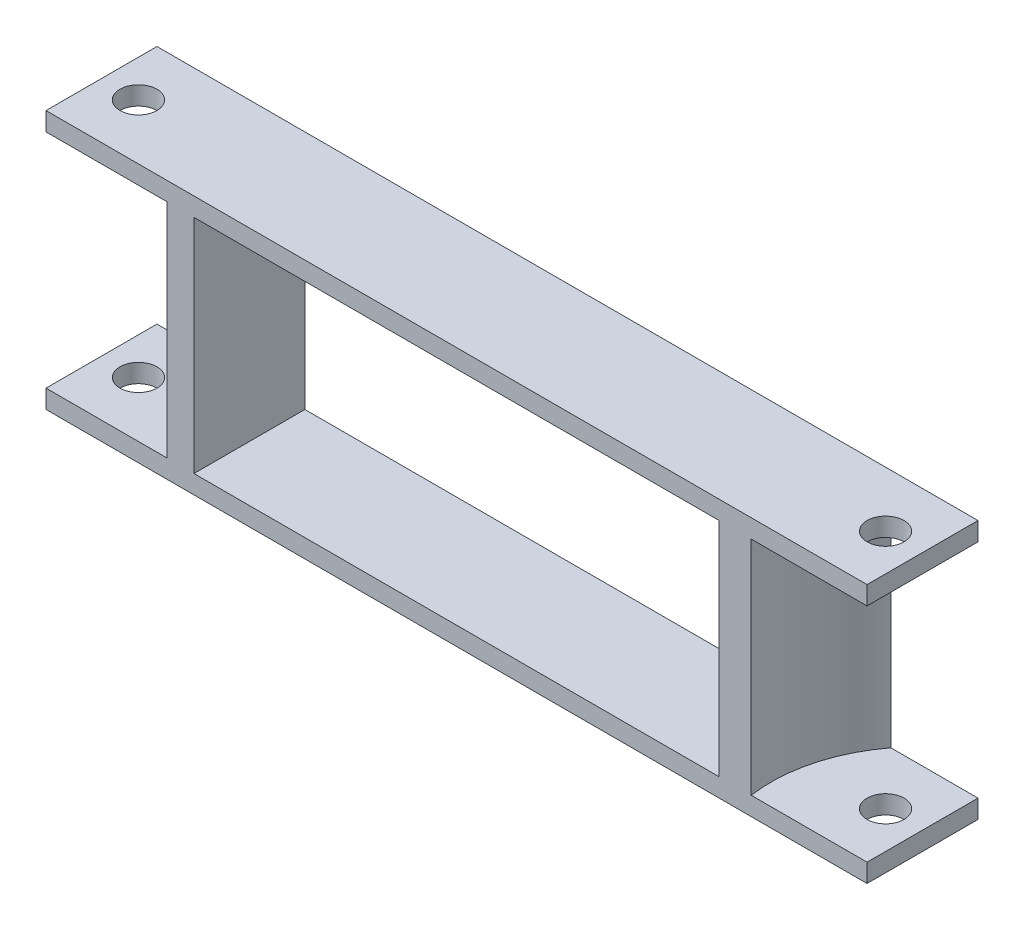
ISO-10303-21;
HEADER;
FILE_DESCRIPTION(('STEP AP214'),'2;1');
FILE_NAME('part.step','',(''),(''),'','','');
FILE_SCHEMA(('AUTOMOTIVE_DESIGN { 1 0 10303 214 1 1 1 1 }'));
ENDSEC;
DATA;
#1=APPLICATION_CONTEXT('core data for automotive mechanical design processes');
#2=APPLICATION_PROTOCOL_DEFINITION('international standard','automotive_design',2000,#1);
#3=PRODUCT_CONTEXT('',#1,'mechanical');
#4=PRODUCT('Part','Part','',(#3));
#5=PRODUCT_RELATED_PRODUCT_CATEGORY('part','',(#4));
#6=PRODUCT_DEFINITION_FORMATION('','',#4);
#7=PRODUCT_DEFINITION_CONTEXT('part definition',#1,'design');
#8=PRODUCT_DEFINITION('design','',#6,#7);
#9=PRODUCT_DEFINITION_SHAPE('','',#8);
#10=(LENGTH_UNIT() NAMED_UNIT(*) SI_UNIT(.MILLI.,.METRE.));
#11=(NAMED_UNIT(*) PLANE_ANGLE_UNIT() SI_UNIT($,.RADIAN.));
#12=(NAMED_UNIT(*) SI_UNIT($,.STERADIAN.) SOLID_ANGLE_UNIT());
#13=UNCERTAINTY_MEASURE_WITH_UNIT(LENGTH_MEASURE(1.E-05),#10,'distance_accuracy_value','');
#14=(GEOMETRIC_REPRESENTATION_CONTEXT(3) GLOBAL_UNCERTAINTY_ASSIGNED_CONTEXT((#13)) GLOBAL_UNIT_ASSIGNED_CONTEXT((#10,
#11,#12)) REPRESENTATION_CONTEXT('',''));
#15=CARTESIAN_POINT('',(0.,0.,0.));
#16=DIRECTION('',(0.,0.,1.));
#17=DIRECTION('',(1.,0.,0.));
#18=AXIS2_PLACEMENT_3D('',#15,#16,#17);
#19=CARTESIAN_POINT('',(-36.1060293280182,70.,11.328125));
#20=DIRECTION('',(1.,0.,0.));
#21=DIRECTION('',(0.,0.,-1.));
#22=AXIS2_PLACEMENT_3D('',#19,#20,#21);
#23=PLANE('',#22);
#24=DIRECTION('',(0.,0.,-1.));
#25=VECTOR('',#24,1.);
#26=CARTESIAN_POINT('',(-36.1060293280182,65.,11.328125));
#27=LINE('',#26,#25);
#28=CARTESIAN_POINT('',(-36.1060293280182,65.,11.328125));
#29=VERTEX_POINT('',#28);
#30=CARTESIAN_POINT('',(-36.1060293280182,65.,-18.671875));
#31=VERTEX_POINT('',#30);
#32=EDGE_CURVE('E242',#29,#31,#27,.T.);
#33=ORIENTED_EDGE('',*,*,#32,.F.);
#34=DIRECTION('',(0.,-1.,0.));
#35=VECTOR('',#34,1.);
#36=CARTESIAN_POINT('',(-36.1060293280182,70.,11.328125));
#37=LINE('',#36,#35);
#38=CARTESIAN_POINT('',(-36.1060293280182,70.,11.328125));
#39=VERTEX_POINT('',#38);
#40=EDGE_CURVE('E328',#39,#29,#37,.T.);
#41=ORIENTED_EDGE('',*,*,#40,.F.);
#42=DIRECTION('',(0.,0.,1.));
#43=VECTOR('',#42,1.);
#44=CARTESIAN_POINT('',(-36.1060293280182,70.,11.328125));
#45=LINE('',#44,#43);
#46=CARTESIAN_POINT('',(-36.1060293280182,70.,-18.671875));
#47=VERTEX_POINT('',#46);
#48=EDGE_CURVE('E284',#47,#39,#45,.T.);
#49=ORIENTED_EDGE('',*,*,#48,.F.);
#50=DIRECTION('',(0.,-1.,0.));
#51=VECTOR('',#50,1.);
#52=CARTESIAN_POINT('',(-36.1060293280182,70.,-18.671875));
#53=LINE('',#52,#51);
#54=EDGE_CURVE('E313',#47,#31,#53,.T.);
#55=ORIENTED_EDGE('',*,*,#54,.T.);
#56=EDGE_LOOP('',(#33,#41,#49,#55));
#57=FACE_BOUND('',#56,.T.);
#58=ADVANCED_FACE('F39',(#57),#23,.F.);
#59=CARTESIAN_POINT('',(185.893970671982,70.,11.328125));
#60=DIRECTION('',(-1.,0.,0.));
#61=DIRECTION('',(0.,0.,1.));
#62=AXIS2_PLACEMENT_3D('',#59,#60,#61);
#63=PLANE('',#62);
#64=DIRECTION('',(0.,0.,1.));
#65=VECTOR('',#64,1.);
#66=CARTESIAN_POINT('',(185.893970671982,65.,11.328125));
#67=LINE('',#66,#65);
#68=CARTESIAN_POINT('',(185.893970671982,65.,-18.671875));
#69=VERTEX_POINT('',#68);
#70=CARTESIAN_POINT('',(185.893970671982,65.,11.328125));
#71=VERTEX_POINT('',#70);
#72=EDGE_CURVE('E219',#69,#71,#67,.T.);
#73=ORIENTED_EDGE('',*,*,#72,.F.);
#74=DIRECTION('',(0.,-1.,0.));
#75=VECTOR('',#74,1.);
#76=CARTESIAN_POINT('',(185.893970671982,70.,-18.671875));
#77=LINE('',#76,#75);
#78=CARTESIAN_POINT('',(185.893970671982,70.,-18.671875));
#79=VERTEX_POINT('',#78);
#80=EDGE_CURVE('E318',#79,#69,#77,.T.);
#81=ORIENTED_EDGE('',*,*,#80,.F.);
#82=DIRECTION('',(0.,0.,-1.));
#83=VECTOR('',#82,1.);
#84=CARTESIAN_POINT('',(185.893970671982,70.,11.328125));
#85=LINE('',#84,#83);
#86=CARTESIAN_POINT('',(185.893970671982,70.,11.328125));
#87=VERTEX_POINT('',#86);
#88=EDGE_CURVE('E292',#87,#79,#85,.T.);
#89=ORIENTED_EDGE('',*,*,#88,.F.);
#90=DIRECTION('',(0.,-1.,0.));
#91=VECTOR('',#90,1.);
#92=CARTESIAN_POINT('',(185.893970671982,70.,11.328125));
#93=LINE('',#92,#91);
#94=EDGE_CURVE('E323',#87,#71,#93,.T.);
#95=ORIENTED_EDGE('',*,*,#94,.T.);
#96=EDGE_LOOP('',(#73,#81,#89,#95));
#97=FACE_BOUND('',#96,.T.);
#98=ADVANCED_FACE('F360',(#97),#63,.F.);
#99=CARTESIAN_POINT('',(-26.1060293280182,70.,-3.671875));
#100=DIRECTION('',(0.,-1.,0.));
#101=DIRECTION('',(0.,0.,-1.));
#102=AXIS2_PLACEMENT_3D('',#99,#100,#101);
#103=CYLINDRICAL_SURFACE('',#102,5.);
#104=CARTESIAN_POINT('',(-26.1060293280182,70.,-3.671875));
#105=DIRECTION('',(0.,1.,0.));
#106=DIRECTION('',(0.,0.,1.));
#107=AXIS2_PLACEMENT_3D('',#104,#105,#106);
#108=CIRCLE('',#107,5.);
#109=CARTESIAN_POINT('',(-26.1060293280182,70.,1.328125));
#110=VERTEX_POINT('',#109);
#111=EDGE_CURVE('E276',#110,#110,#108,.T.);
#112=ORIENTED_EDGE('',*,*,#111,.T.);
#113=EDGE_LOOP('',(#112));
#114=FACE_BOUND('',#113,.T.);
#115=CARTESIAN_POINT('',(-26.1060293280182,65.,-3.671875));
#116=DIRECTION('',(0.,-1.,0.));
#117=DIRECTION('',(0.,0.,-1.));
#118=AXIS2_PLACEMENT_3D('',#115,#116,#117);
#119=CIRCLE('',#118,5.);
#120=CARTESIAN_POINT('',(-26.1060293280182,65.,-8.671875));
#121=VERTEX_POINT('',#120);
#122=EDGE_CURVE('E238',#121,#121,#119,.T.);
#123=ORIENTED_EDGE('',*,*,#122,.T.);
#124=EDGE_LOOP('',(#123));
#125=FACE_BOUND('',#124,.T.);
#126=ADVANCED_FACE('F412',(#114,#125),#103,.F.);
#127=CARTESIAN_POINT('',(175.893970671982,70.,-3.671875));
#128=DIRECTION('',(0.,-1.,0.));
#129=DIRECTION('',(0.,0.,-1.));
#130=AXIS2_PLACEMENT_3D('',#127,#128,#129);
#131=CYLINDRICAL_SURFACE('',#130,4.99999999999999);
#132=CARTESIAN_POINT('',(175.893970671982,70.,-3.671875));
#133=DIRECTION('',(0.,1.,0.));
#134=DIRECTION('',(0.,0.,1.));
#135=AXIS2_PLACEMENT_3D('',#132,#133,#134);
#136=CIRCLE('',#135,4.99999999999999);
#137=CARTESIAN_POINT('',(175.893970671982,70.,1.32812499999999));
#138=VERTEX_POINT('',#137);
#139=EDGE_CURVE('E268',#138,#138,#136,.T.);
#140=ORIENTED_EDGE('',*,*,#139,.T.);
#141=EDGE_LOOP('',(#140));
#142=FACE_BOUND('',#141,.T.);
#143=CARTESIAN_POINT('',(175.893970671982,65.,-3.671875));
#144=DIRECTION('',(0.,-1.,0.));
#145=DIRECTION('',(0.,0.,-1.));
#146=AXIS2_PLACEMENT_3D('',#143,#144,#145);
#147=CIRCLE('',#146,4.99999999999999);
#148=CARTESIAN_POINT('',(175.893970671982,65.,-8.67187499999999));
#149=VERTEX_POINT('',#148);
#150=EDGE_CURVE('E210',#149,#149,#147,.T.);
#151=ORIENTED_EDGE('',*,*,#150,.T.);
#152=EDGE_LOOP('',(#151));
#153=FACE_BOUND('',#152,.T.);
#154=ADVANCED_FACE('F404',(#142,#153),#131,.F.);
#155=CARTESIAN_POINT('',(0.,70.,0.));
#156=DIRECTION('',(0.,-1.,0.));
#157=DIRECTION('',(0.,0.,-1.));
#158=AXIS2_PLACEMENT_3D('',#155,#156,#157);
#159=PLANE('',#158);
#160=ORIENTED_EDGE('',*,*,#48,.T.);
#161=DIRECTION('',(1.,0.,0.));
#162=VECTOR('',#161,1.);
#163=CARTESIAN_POINT('',(-36.1060293280182,70.,11.328125));
#164=LINE('',#163,#162);
#165=EDGE_CURVE('E288',#39,#87,#164,.T.);
#166=ORIENTED_EDGE('',*,*,#165,.T.);
#167=ORIENTED_EDGE('',*,*,#88,.T.);
#168=DIRECTION('',(-1.,0.,0.));
#169=VECTOR('',#168,1.);
#170=CARTESIAN_POINT('',(-36.1060293280182,70.,-18.671875));
#171=LINE('',#170,#169);
#172=EDGE_CURVE('E295',#79,#47,#171,.T.);
#173=ORIENTED_EDGE('',*,*,#172,.T.);
#174=EDGE_LOOP('',(#160,#166,#167,#173));
#175=FACE_BOUND('',#174,.T.);
#176=ORIENTED_EDGE('',*,*,#111,.F.);
#177=EDGE_LOOP('',(#176));
#178=FACE_BOUND('',#177,.T.);
#179=ORIENTED_EDGE('',*,*,#139,.F.);
#180=EDGE_LOOP('',(#179));
#181=FACE_BOUND('',#180,.T.);
#182=ADVANCED_FACE('F401',(#175,#178,#181),#159,.F.);
#183=CARTESIAN_POINT('',(0.,0.,0.));
#184=DIRECTION('',(0.,-1.,0.));
#185=DIRECTION('',(0.,0.,-1.));
#186=AXIS2_PLACEMENT_3D('',#183,#184,#185);
#187=PLANE('',#186);
#188=CARTESIAN_POINT('',(-26.1060293280182,0.,-3.671875));
#189=DIRECTION('',(0.,1.,0.));
#190=DIRECTION('',(0.,0.,1.));
#191=AXIS2_PLACEMENT_3D('',#188,#189,#190);
#192=CIRCLE('',#191,5.);
#193=CARTESIAN_POINT('',(-26.1060293280182,0.,1.328125));
#194=VERTEX_POINT('',#193);
#195=EDGE_CURVE('E272',#194,#194,#192,.T.);
#196=ORIENTED_EDGE('',*,*,#195,.T.);
#197=EDGE_LOOP('',(#196));
#198=FACE_BOUND('',#197,.T.);
#199=DIRECTION('',(0.,0.,1.));
#200=VECTOR('',#199,1.);
#201=CARTESIAN_POINT('',(-36.1060293280182,0.,11.328125));
#202=LINE('',#201,#200);
#203=CARTESIAN_POINT('',(-36.1060293280182,0.,-18.671875));
#204=VERTEX_POINT('',#203);
#205=CARTESIAN_POINT('',(-36.1060293280182,0.,11.328125));
#206=VERTEX_POINT('',#205);
#207=EDGE_CURVE('E280',#204,#206,#202,.T.);
#208=ORIENTED_EDGE('',*,*,#207,.F.);
#209=DIRECTION('',(-1.,0.,0.));
#210=VECTOR('',#209,1.);
#211=CARTESIAN_POINT('',(-36.1060293280182,0.,-18.671875));
#212=LINE('',#211,#210);
#213=CARTESIAN_POINT('',(185.893970671982,0.,-18.671875));
#214=VERTEX_POINT('',#213);
#215=EDGE_CURVE('E289',#214,#204,#212,.T.);
#216=ORIENTED_EDGE('',*,*,#215,.F.);
#217=DIRECTION('',(0.,0.,-1.));
#218=VECTOR('',#217,1.);
#219=CARTESIAN_POINT('',(185.893970671982,0.,11.328125));
#220=LINE('',#219,#218);
#221=CARTESIAN_POINT('',(185.893970671982,0.,11.328125));
#222=VERTEX_POINT('',#221);
#223=EDGE_CURVE('E306',#222,#214,#220,.T.);
#224=ORIENTED_EDGE('',*,*,#223,.F.);
#225=DIRECTION('',(1.,0.,0.));
#226=VECTOR('',#225,1.);
#227=CARTESIAN_POINT('',(-36.1060293280182,0.,11.328125));
#228=LINE('',#227,#226);
#229=EDGE_CURVE('E302',#206,#222,#228,.T.);
#230=ORIENTED_EDGE('',*,*,#229,.F.);
#231=EDGE_LOOP('',(#208,#216,#224,#230));
#232=FACE_BOUND('',#231,.T.);
#233=CARTESIAN_POINT('',(175.893970671982,0.,-3.671875));
#234=DIRECTION('',(0.,1.,0.));
#235=DIRECTION('',(0.,0.,1.));
#236=AXIS2_PLACEMENT_3D('',#233,#234,#235);
#237=CIRCLE('',#236,4.99999999999999);
#238=CARTESIAN_POINT('',(175.893970671982,0.,1.32812499999999));
#239=VERTEX_POINT('',#238);
#240=EDGE_CURVE('E267',#239,#239,#237,.T.);
#241=ORIENTED_EDGE('',*,*,#240,.T.);
#242=EDGE_LOOP('',(#241));
#243=FACE_BOUND('',#242,.T.);
#244=ADVANCED_FACE('F382',(#198,#232,#243),#187,.T.);
#245=CARTESIAN_POINT('',(-36.1060293280182,5.,11.328125));
#246=VERTEX_POINT('',#245);
#247=EDGE_CURVE('E327',#246,#206,#37,.T.);
#248=ORIENTED_EDGE('',*,*,#247,.F.);
#249=DIRECTION('',(0.,0.,-1.));
#250=VECTOR('',#249,1.);
#251=CARTESIAN_POINT('',(-36.1060293280182,5.,11.328125));
#252=LINE('',#251,#250);
#253=CARTESIAN_POINT('',(-36.1060293280182,5.,-18.671875));
#254=VERTEX_POINT('',#253);
#255=EDGE_CURVE('E253',#246,#254,#252,.T.);
#256=ORIENTED_EDGE('',*,*,#255,.T.);
#257=EDGE_CURVE('E298',#254,#204,#53,.T.);
#258=ORIENTED_EDGE('',*,*,#257,.T.);
#259=ORIENTED_EDGE('',*,*,#207,.T.);
#260=EDGE_LOOP('',(#248,#256,#258,#259));
#261=FACE_BOUND('',#260,.T.);
#262=ADVANCED_FACE('F41',(#261),#23,.F.);
#263=CARTESIAN_POINT('',(-36.1060293280182,70.,11.328125));
#264=DIRECTION('',(0.,0.,-1.));
#265=DIRECTION('',(-1.,0.,0.));
#266=AXIS2_PLACEMENT_3D('',#263,#264,#265);
#267=PLANE('',#266);
#268=DIRECTION('',(1.,0.,0.));
#269=VECTOR('',#268,1.);
#270=CARTESIAN_POINT('',(3.89397067198179,5.,11.328125));
#271=LINE('',#270,#269);
#272=CARTESIAN_POINT('',(3.89397067198179,5.,11.328125));
#273=VERTEX_POINT('',#272);
#274=CARTESIAN_POINT('',(145.893970671982,5.,11.328125));
#275=VERTEX_POINT('',#274);
#276=EDGE_CURVE('E186',#273,#275,#271,.T.);
#277=ORIENTED_EDGE('',*,*,#276,.F.);
#278=DIRECTION('',(0.,-1.,0.));
#279=VECTOR('',#278,1.);
#280=CARTESIAN_POINT('',(3.89397067198178,65.,11.328125));
#281=LINE('',#280,#279);
#282=CARTESIAN_POINT('',(3.89397067198178,65.,11.328125));
#283=VERTEX_POINT('',#282);
#284=EDGE_CURVE('E55',#283,#273,#281,.T.);
#285=ORIENTED_EDGE('',*,*,#284,.F.);
#286=DIRECTION('',(-1.,0.,0.));
#287=VECTOR('',#286,1.);
#288=CARTESIAN_POINT('',(3.89397067198178,65.,11.328125));
#289=LINE('',#288,#287);
#290=CARTESIAN_POINT('',(145.893970671982,65.,11.328125));
#291=VERTEX_POINT('',#290);
#292=EDGE_CURVE('E173',#291,#283,#289,.T.);
#293=ORIENTED_EDGE('',*,*,#292,.F.);
#294=DIRECTION('',(0.,1.,0.));
#295=VECTOR('',#294,1.);
#296=CARTESIAN_POINT('',(145.893970671982,65.,11.328125));
#297=LINE('',#296,#295);
#298=EDGE_CURVE('E177',#275,#291,#297,.T.);
#299=ORIENTED_EDGE('',*,*,#298,.F.);
#300=EDGE_LOOP('',(#277,#285,#293,#299));
#301=FACE_BOUND('',#300,.T.);
#302=DIRECTION('',(0.,1.,0.));
#303=VECTOR('',#302,1.);
#304=CARTESIAN_POINT('',(-3.40368519777205,5.,11.328125));
#305=LINE('',#304,#303);
#306=CARTESIAN_POINT('',(-3.40368519777205,5.,11.328125));
#307=VERTEX_POINT('',#306);
#308=CARTESIAN_POINT('',(-3.40368519777205,65.,11.328125));
#309=VERTEX_POINT('',#308);
#310=EDGE_CURVE('E264',#307,#309,#305,.T.);
#311=ORIENTED_EDGE('',*,*,#310,.F.);
#312=DIRECTION('',(-1.,0.,0.));
#313=VECTOR('',#312,1.);
#314=CARTESIAN_POINT('',(-36.1060293280182,5.,11.328125));
#315=LINE('',#314,#313);
#316=EDGE_CURVE('E257',#307,#246,#315,.T.);
#317=ORIENTED_EDGE('',*,*,#316,.T.);
#318=ORIENTED_EDGE('',*,*,#247,.T.);
#319=ORIENTED_EDGE('',*,*,#229,.T.);
#320=CARTESIAN_POINT('',(185.893970671982,5.,11.328125));
#321=VERTEX_POINT('',#320);
#322=EDGE_CURVE('E322',#321,#222,#93,.T.);
#323=ORIENTED_EDGE('',*,*,#322,.F.);
#324=DIRECTION('',(-1.,0.,0.));
#325=VECTOR('',#324,1.);
#326=CARTESIAN_POINT('',(-36.1060293280182,5.,11.328125));
#327=LINE('',#326,#325);
#328=CARTESIAN_POINT('',(154.572983376168,5.,11.328125));
#329=VERTEX_POINT('',#328);
#330=EDGE_CURVE('E234',#321,#329,#327,.T.);
#331=ORIENTED_EDGE('',*,*,#330,.T.);
#332=DIRECTION('',(0.,1.,0.));
#333=VECTOR('',#332,1.);
#334=CARTESIAN_POINT('',(154.572983376168,5.,11.328125));
#335=LINE('',#334,#333);
#336=CARTESIAN_POINT('',(154.572983376168,65.,11.328125));
#337=VERTEX_POINT('',#336);
#338=EDGE_CURVE('E261',#337,#329,#335,.F.);
#339=ORIENTED_EDGE('',*,*,#338,.F.);
#340=DIRECTION('',(-1.,0.,0.));
#341=VECTOR('',#340,1.);
#342=CARTESIAN_POINT('',(-36.1060293280182,65.,11.328125));
#343=LINE('',#342,#341);
#344=EDGE_CURVE('E222',#71,#337,#343,.T.);
#345=ORIENTED_EDGE('',*,*,#344,.F.);
#346=ORIENTED_EDGE('',*,*,#94,.F.);
#347=ORIENTED_EDGE('',*,*,#165,.F.);
#348=ORIENTED_EDGE('',*,*,#40,.T.);
#349=DIRECTION('',(-1.,0.,0.));
#350=VECTOR('',#349,1.);
#351=CARTESIAN_POINT('',(-36.1060293280182,65.,11.328125));
#352=LINE('',#351,#350);
#353=EDGE_CURVE('E245',#309,#29,#352,.T.);
#354=ORIENTED_EDGE('',*,*,#353,.F.);
#355=EDGE_LOOP('',(#311,#317,#318,#319,#323,#331,#339,#345,#346,#347,#348,#354));
#356=FACE_BOUND('',#355,.T.);
#357=ADVANCED_FACE('F365',(#301,#356),#267,.F.);
#358=CARTESIAN_POINT('',(185.893970671982,5.,-18.671875));
#359=VERTEX_POINT('',#358);
#360=EDGE_CURVE('E317',#359,#214,#77,.T.);
#361=ORIENTED_EDGE('',*,*,#360,.F.);
#362=DIRECTION('',(0.,0.,1.));
#363=VECTOR('',#362,1.);
#364=CARTESIAN_POINT('',(185.893970671982,5.,11.328125));
#365=LINE('',#364,#363);
#366=EDGE_CURVE('E230',#359,#321,#365,.T.);
#367=ORIENTED_EDGE('',*,*,#366,.T.);
#368=ORIENTED_EDGE('',*,*,#322,.T.);
#369=ORIENTED_EDGE('',*,*,#223,.T.);
#370=EDGE_LOOP('',(#361,#367,#368,#369));
#371=FACE_BOUND('',#370,.T.);
#372=ADVANCED_FACE('F371',(#371),#63,.F.);
#373=CARTESIAN_POINT('',(-36.1060293280182,70.,-18.671875));
#374=DIRECTION('',(0.,0.,1.));
#375=DIRECTION('',(1.,0.,0.));
#376=AXIS2_PLACEMENT_3D('',#373,#374,#375);
#377=PLANE('',#376);
#378=DIRECTION('',(-1.,0.,0.));
#379=VECTOR('',#378,1.);
#380=CARTESIAN_POINT('',(3.89397067198178,65.,-18.671875));
#381=LINE('',#380,#379);
#382=CARTESIAN_POINT('',(145.893970671982,65.,-18.671875));
#383=VERTEX_POINT('',#382);
#384=CARTESIAN_POINT('',(3.89397067198178,65.,-18.671875));
#385=VERTEX_POINT('',#384);
#386=EDGE_CURVE('E161',#383,#385,#381,.T.);
#387=ORIENTED_EDGE('',*,*,#386,.T.);
#388=DIRECTION('',(0.,-1.,0.));
#389=VECTOR('',#388,1.);
#390=CARTESIAN_POINT('',(3.89397067198178,65.,-18.671875));
#391=LINE('',#390,#389);
#392=CARTESIAN_POINT('',(3.89397067198179,5.,-18.671875));
#393=VERTEX_POINT('',#392);
#394=EDGE_CURVE('E154',#385,#393,#391,.T.);
#395=ORIENTED_EDGE('',*,*,#394,.T.);
#396=DIRECTION('',(1.,0.,0.));
#397=VECTOR('',#396,1.);
#398=CARTESIAN_POINT('',(3.89397067198179,5.,-18.671875));
#399=LINE('',#398,#397);
#400=CARTESIAN_POINT('',(145.893970671982,5.,-18.671875));
#401=VERTEX_POINT('',#400);
#402=EDGE_CURVE('E164',#393,#401,#399,.T.);
#403=ORIENTED_EDGE('',*,*,#402,.T.);
#404=DIRECTION('',(0.,1.,0.));
#405=VECTOR('',#404,1.);
#406=CARTESIAN_POINT('',(145.893970671982,65.,-18.671875));
#407=LINE('',#406,#405);
#408=EDGE_CURVE('E63',#401,#383,#407,.T.);
#409=ORIENTED_EDGE('',*,*,#408,.T.);
#410=EDGE_LOOP('',(#387,#395,#403,#409));
#411=FACE_BOUND('',#410,.T.);
#412=ORIENTED_EDGE('',*,*,#257,.F.);
#413=DIRECTION('',(1.,0.,0.));
#414=VECTOR('',#413,1.);
#415=CARTESIAN_POINT('',(-36.1060293280182,5.,-18.671875));
#416=LINE('',#415,#414);
#417=CARTESIAN_POINT('',(-8.33885668442236,5.,-18.671875));
#418=VERTEX_POINT('',#417);
#419=EDGE_CURVE('E249',#254,#418,#416,.T.);
#420=ORIENTED_EDGE('',*,*,#419,.T.);
#421=DIRECTION('',(0.,1.,0.));
#422=VECTOR('',#421,1.);
#423=CARTESIAN_POINT('',(-8.33885668442236,5.,-18.671875));
#424=LINE('',#423,#422);
#425=CARTESIAN_POINT('',(-8.33885668442236,65.,-18.671875));
#426=VERTEX_POINT('',#425);
#427=EDGE_CURVE('E11',#426,#418,#424,.F.);
#428=ORIENTED_EDGE('',*,*,#427,.F.);
#429=DIRECTION('',(1.,0.,0.));
#430=VECTOR('',#429,1.);
#431=CARTESIAN_POINT('',(-36.1060293280182,65.,-18.671875));
#432=LINE('',#431,#430);
#433=EDGE_CURVE('E239',#31,#426,#432,.T.);
#434=ORIENTED_EDGE('',*,*,#433,.F.);
#435=ORIENTED_EDGE('',*,*,#54,.F.);
#436=ORIENTED_EDGE('',*,*,#172,.F.);
#437=ORIENTED_EDGE('',*,*,#80,.T.);
#438=DIRECTION('',(1.,0.,0.));
#439=VECTOR('',#438,1.);
#440=CARTESIAN_POINT('',(-36.1060293280182,65.,-18.671875));
#441=LINE('',#440,#439);
#442=CARTESIAN_POINT('',(162.349650774549,65.,-18.671875));
#443=VERTEX_POINT('',#442);
#444=EDGE_CURVE('E216',#443,#69,#441,.T.);
#445=ORIENTED_EDGE('',*,*,#444,.F.);
#446=DIRECTION('',(0.,1.,0.));
#447=VECTOR('',#446,1.);
#448=CARTESIAN_POINT('',(162.349650774549,5.,-18.671875));
#449=LINE('',#448,#447);
#450=CARTESIAN_POINT('',(162.349650774549,5.,-18.671875));
#451=VERTEX_POINT('',#450);
#452=EDGE_CURVE('E48',#451,#443,#449,.T.);
#453=ORIENTED_EDGE('',*,*,#452,.F.);
#454=DIRECTION('',(1.,0.,0.));
#455=VECTOR('',#454,1.);
#456=CARTESIAN_POINT('',(-36.1060293280182,5.,-18.671875));
#457=LINE('',#456,#455);
#458=EDGE_CURVE('E226',#451,#359,#457,.T.);
#459=ORIENTED_EDGE('',*,*,#458,.T.);
#460=ORIENTED_EDGE('',*,*,#360,.T.);
#461=ORIENTED_EDGE('',*,*,#215,.T.);
#462=EDGE_LOOP('',(#412,#420,#428,#434,#435,#436,#437,#445,#453,#459,#460,#461));
#463=FACE_BOUND('',#462,.T.);
#464=ADVANCED_FACE('F169',(#411,#463),#377,.F.);
#465=CARTESIAN_POINT('',(-26.1060293280182,5.,-3.671875));
#466=DIRECTION('',(0.,-1.,0.));
#467=DIRECTION('',(0.,0.,-1.));
#468=AXIS2_PLACEMENT_3D('',#465,#466,#467);
#469=CIRCLE('',#468,5.);
#470=CARTESIAN_POINT('',(-26.1060293280182,5.,-8.671875));
#471=VERTEX_POINT('',#470);
#472=EDGE_CURVE('E248',#471,#471,#469,.T.);
#473=ORIENTED_EDGE('',*,*,#472,.F.);
#474=EDGE_LOOP('',(#473));
#475=FACE_BOUND('',#474,.T.);
#476=ORIENTED_EDGE('',*,*,#195,.F.);
#477=EDGE_LOOP('',(#476));
#478=FACE_BOUND('',#477,.T.);
#479=ADVANCED_FACE('F444',(#475,#478),#103,.F.);
#480=CARTESIAN_POINT('',(175.893970671982,5.,-3.671875));
#481=DIRECTION('',(0.,-1.,0.));
#482=DIRECTION('',(0.,0.,-1.));
#483=AXIS2_PLACEMENT_3D('',#480,#481,#482);
#484=CIRCLE('',#483,4.99999999999999);
#485=CARTESIAN_POINT('',(175.893970671982,5.,-8.67187499999999));
#486=VERTEX_POINT('',#485);
#487=EDGE_CURVE('E225',#486,#486,#484,.T.);
#488=ORIENTED_EDGE('',*,*,#487,.F.);
#489=EDGE_LOOP('',(#488));
#490=FACE_BOUND('',#489,.T.);
#491=ORIENTED_EDGE('',*,*,#240,.F.);
#492=EDGE_LOOP('',(#491));
#493=FACE_BOUND('',#492,.T.);
#494=ADVANCED_FACE('F414',(#490,#493),#131,.F.);
#495=CARTESIAN_POINT('',(194.158036125962,5.,5.58150870899965));
#496=DIRECTION('',(0.,1.,0.));
#497=DIRECTION('',(0.,0.,1.));
#498=AXIS2_PLACEMENT_3D('',#495,#496,#497);
#499=CYLINDRICAL_SURFACE('',#498,40.);
#500=ORIENTED_EDGE('',*,*,#338,.T.);
#501=CARTESIAN_POINT('',(194.158036125962,5.,5.58150870899965));
#502=DIRECTION('',(0.,-1.,0.));
#503=DIRECTION('',(0.,0.,-1.));
#504=AXIS2_PLACEMENT_3D('',#501,#502,#503);
#505=CIRCLE('',#504,40.);
#506=EDGE_CURVE('E206',#329,#451,#505,.T.);
#507=ORIENTED_EDGE('',*,*,#506,.T.);
#508=ORIENTED_EDGE('',*,*,#452,.T.);
#509=CARTESIAN_POINT('',(194.158036125962,65.,5.58150870899965));
#510=DIRECTION('',(0.,-1.,0.));
#511=DIRECTION('',(0.,0.,-1.));
#512=AXIS2_PLACEMENT_3D('',#509,#510,#511);
#513=CIRCLE('',#512,40.);
#514=EDGE_CURVE('E195',#337,#443,#513,.T.);
#515=ORIENTED_EDGE('',*,*,#514,.F.);
#516=EDGE_LOOP('',(#500,#507,#508,#515));
#517=FACE_BOUND('',#516,.T.);
#518=ADVANCED_FACE('F349',(#517),#499,.F.);
#519=CARTESIAN_POINT('',(194.158036125962,5.,5.58150870899965));
#520=DIRECTION('',(0.,-1.,0.));
#521=DIRECTION('',(0.,0.,-1.));
#522=AXIS2_PLACEMENT_3D('',#519,#520,#521);
#523=PLANE('',#522);
#524=ORIENTED_EDGE('',*,*,#487,.T.);
#525=EDGE_LOOP('',(#524));
#526=FACE_BOUND('',#525,.T.);
#527=ORIENTED_EDGE('',*,*,#366,.F.);
#528=ORIENTED_EDGE('',*,*,#458,.F.);
#529=ORIENTED_EDGE('',*,*,#506,.F.);
#530=ORIENTED_EDGE('',*,*,#330,.F.);
#531=EDGE_LOOP('',(#527,#528,#529,#530));
#532=FACE_BOUND('',#531,.T.);
#533=ADVANCED_FACE('F368',(#526,#532),#523,.F.);
#534=CARTESIAN_POINT('',(194.158036125962,65.,5.58150870899965));
#535=DIRECTION('',(0.,-1.,0.));
#536=DIRECTION('',(0.,0.,-1.));
#537=AXIS2_PLACEMENT_3D('',#534,#535,#536);
#538=PLANE('',#537);
#539=ORIENTED_EDGE('',*,*,#150,.F.);
#540=EDGE_LOOP('',(#539));
#541=FACE_BOUND('',#540,.T.);
#542=ORIENTED_EDGE('',*,*,#344,.T.);
#543=ORIENTED_EDGE('',*,*,#514,.T.);
#544=ORIENTED_EDGE('',*,*,#444,.T.);
#545=ORIENTED_EDGE('',*,*,#72,.T.);
#546=EDGE_LOOP('',(#542,#543,#544,#545));
#547=FACE_BOUND('',#546,.T.);
#548=ADVANCED_FACE('F357',(#541,#547),#538,.T.);
#549=CARTESIAN_POINT('',(-42.3793726451596,5.,2.33391641872061));
#550=DIRECTION('',(0.,1.,0.));
#551=DIRECTION('',(0.,0.,1.));
#552=AXIS2_PLACEMENT_3D('',#549,#550,#551);
#553=CYLINDRICAL_SURFACE('',#552,40.);
#554=ORIENTED_EDGE('',*,*,#310,.T.);
#555=CARTESIAN_POINT('',(-42.3793726451596,65.,2.33391641872061));
#556=DIRECTION('',(0.,-1.,0.));
#557=DIRECTION('',(0.,0.,-1.));
#558=AXIS2_PLACEMENT_3D('',#555,#556,#557);
#559=CIRCLE('',#558,40.);
#560=EDGE_CURVE('E201',#426,#309,#559,.T.);
#561=ORIENTED_EDGE('',*,*,#560,.F.);
#562=ORIENTED_EDGE('',*,*,#427,.T.);
#563=CARTESIAN_POINT('',(-42.3793726451596,5.,2.33391641872061));
#564=DIRECTION('',(0.,-1.,0.));
#565=DIRECTION('',(0.,0.,-1.));
#566=AXIS2_PLACEMENT_3D('',#563,#564,#565);
#567=CIRCLE('',#566,40.);
#568=EDGE_CURVE('E205',#418,#307,#567,.T.);
#569=ORIENTED_EDGE('',*,*,#568,.T.);
#570=EDGE_LOOP('',(#554,#561,#562,#569));
#571=FACE_BOUND('',#570,.T.);
#572=ADVANCED_FACE('F390',(#571),#553,.F.);
#573=CARTESIAN_POINT('',(-42.3793726451596,5.,2.33391641872061));
#574=DIRECTION('',(0.,-1.,0.));
#575=DIRECTION('',(0.,0.,-1.));
#576=AXIS2_PLACEMENT_3D('',#573,#574,#575);
#577=PLANE('',#576);
#578=ORIENTED_EDGE('',*,*,#472,.T.);
#579=EDGE_LOOP('',(#578));
#580=FACE_BOUND('',#579,.T.);
#581=ORIENTED_EDGE('',*,*,#568,.F.);
#582=ORIENTED_EDGE('',*,*,#419,.F.);
#583=ORIENTED_EDGE('',*,*,#255,.F.);
#584=ORIENTED_EDGE('',*,*,#316,.F.);
#585=EDGE_LOOP('',(#581,#582,#583,#584));
#586=FACE_BOUND('',#585,.T.);
#587=ADVANCED_FACE('F388',(#580,#586),#577,.F.);
#588=CARTESIAN_POINT('',(-42.3793726451596,65.,2.33391641872061));
#589=DIRECTION('',(0.,-1.,0.));
#590=DIRECTION('',(0.,0.,-1.));
#591=AXIS2_PLACEMENT_3D('',#588,#589,#590);
#592=PLANE('',#591);
#593=ORIENTED_EDGE('',*,*,#122,.F.);
#594=EDGE_LOOP('',(#593));
#595=FACE_BOUND('',#594,.T.);
#596=ORIENTED_EDGE('',*,*,#353,.T.);
#597=ORIENTED_EDGE('',*,*,#32,.T.);
#598=ORIENTED_EDGE('',*,*,#433,.T.);
#599=ORIENTED_EDGE('',*,*,#560,.T.);
#600=EDGE_LOOP('',(#596,#597,#598,#599));
#601=FACE_BOUND('',#600,.T.);
#602=ADVANCED_FACE('F496',(#595,#601),#592,.T.);
#603=CARTESIAN_POINT('',(3.89397067198178,65.,-18.671875));
#604=DIRECTION('',(-1.,0.,0.));
#605=DIRECTION('',(0.,-1.,0.));
#606=AXIS2_PLACEMENT_3D('',#603,#604,#605);
#607=PLANE('',#606);
#608=ORIENTED_EDGE('',*,*,#284,.T.);
#609=DIRECTION('',(0.,0.,1.));
#610=VECTOR('',#609,1.);
#611=CARTESIAN_POINT('',(3.89397067198179,5.,-18.671875));
#612=LINE('',#611,#610);
#613=EDGE_CURVE('E150',#393,#273,#612,.T.);
#614=ORIENTED_EDGE('',*,*,#613,.F.);
#615=ORIENTED_EDGE('',*,*,#394,.F.);
#616=DIRECTION('',(0.,0.,1.));
#617=VECTOR('',#616,1.);
#618=CARTESIAN_POINT('',(3.89397067198178,65.,-18.671875));
#619=LINE('',#618,#617);
#620=EDGE_CURVE('E192',#385,#283,#619,.T.);
#621=ORIENTED_EDGE('',*,*,#620,.T.);
#622=EDGE_LOOP('',(#608,#614,#615,#621));
#623=FACE_BOUND('',#622,.T.);
#624=ADVANCED_FACE('F152',(#623),#607,.F.);
#625=CARTESIAN_POINT('',(3.89397067198178,65.,-18.671875));
#626=DIRECTION('',(0.,1.,0.));
#627=DIRECTION('',(0.,0.,1.));
#628=AXIS2_PLACEMENT_3D('',#625,#626,#627);
#629=PLANE('',#628);
#630=ORIENTED_EDGE('',*,*,#292,.T.);
#631=ORIENTED_EDGE('',*,*,#620,.F.);
#632=ORIENTED_EDGE('',*,*,#386,.F.);
#633=DIRECTION('',(0.,0.,1.));
#634=VECTOR('',#633,1.);
#635=CARTESIAN_POINT('',(145.893970671982,65.,-18.671875));
#636=LINE('',#635,#634);
#637=EDGE_CURVE('E196',#383,#291,#636,.T.);
#638=ORIENTED_EDGE('',*,*,#637,.T.);
#639=EDGE_LOOP('',(#630,#631,#632,#638));
#640=FACE_BOUND('',#639,.T.);
#641=ADVANCED_FACE('F568',(#640),#629,.F.);
#642=CARTESIAN_POINT('',(145.893970671982,65.,-18.671875));
#643=DIRECTION('',(1.,0.,0.));
#644=DIRECTION('',(0.,0.,-1.));
#645=AXIS2_PLACEMENT_3D('',#642,#643,#644);
#646=PLANE('',#645);
#647=ORIENTED_EDGE('',*,*,#298,.T.);
#648=ORIENTED_EDGE('',*,*,#637,.F.);
#649=ORIENTED_EDGE('',*,*,#408,.F.);
#650=DIRECTION('',(0.,0.,1.));
#651=VECTOR('',#650,1.);
#652=CARTESIAN_POINT('',(145.893970671982,5.,-18.671875));
#653=LINE('',#652,#651);
#654=EDGE_CURVE('E160',#401,#275,#653,.T.);
#655=ORIENTED_EDGE('',*,*,#654,.T.);
#656=EDGE_LOOP('',(#647,#648,#649,#655));
#657=FACE_BOUND('',#656,.T.);
#658=ADVANCED_FACE('F574',(#657),#646,.F.);
#659=CARTESIAN_POINT('',(3.89397067198179,5.,-18.671875));
#660=DIRECTION('',(0.,-1.,0.));
#661=DIRECTION('',(1.,0.,0.));
#662=AXIS2_PLACEMENT_3D('',#659,#660,#661);
#663=PLANE('',#662);
#664=ORIENTED_EDGE('',*,*,#276,.T.);
#665=ORIENTED_EDGE('',*,*,#654,.F.);
#666=ORIENTED_EDGE('',*,*,#402,.F.);
#667=ORIENTED_EDGE('',*,*,#613,.T.);
#668=EDGE_LOOP('',(#664,#665,#666,#667));
#669=FACE_BOUND('',#668,.T.);
#670=ADVANCED_FACE('F165',(#669),#663,.F.);
#671=CLOSED_SHELL('',(#58,#98,#126,#154,#182,#244,#262,#357,#372,#464,#479,#494,#518,#533,#548,
#572,#587,#602,#624,#641,#658,#670));
#672=MANIFOLD_SOLID_BREP('B2',#671);
#673=ADVANCED_BREP_SHAPE_REPRESENTATION('',(#18,#672),#14);
#674=SHAPE_DEFINITION_REPRESENTATION(#9,#673);
ENDSEC;
END-ISO-10303-21;
